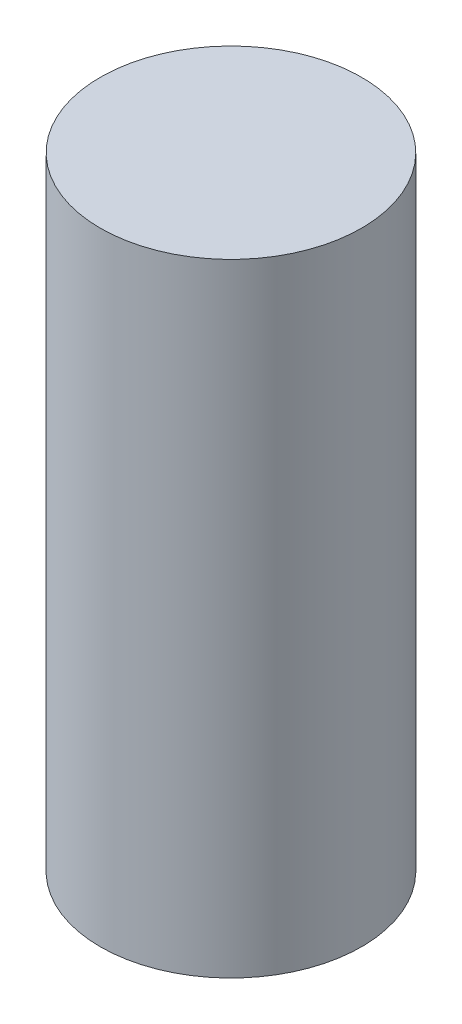
ISO-10303-21;
HEADER;
FILE_DESCRIPTION(('STEP AP214'),'2;1');
FILE_NAME('part.step','',(''),(''),'','','');
FILE_SCHEMA(('AUTOMOTIVE_DESIGN { 1 0 10303 214 1 1 1 1 }'));
ENDSEC;
DATA;
#1=APPLICATION_CONTEXT('core data for automotive mechanical design processes');
#2=APPLICATION_PROTOCOL_DEFINITION('international standard','automotive_design',2000,#1);
#3=PRODUCT_CONTEXT('',#1,'mechanical');
#4=PRODUCT('Part','Part','',(#3));
#5=PRODUCT_RELATED_PRODUCT_CATEGORY('part','',(#4));
#6=PRODUCT_DEFINITION_FORMATION('','',#4);
#7=PRODUCT_DEFINITION_CONTEXT('part definition',#1,'design');
#8=PRODUCT_DEFINITION('design','',#6,#7);
#9=PRODUCT_DEFINITION_SHAPE('','',#8);
#10=(LENGTH_UNIT() NAMED_UNIT(*) SI_UNIT(.MILLI.,.METRE.));
#11=(NAMED_UNIT(*) PLANE_ANGLE_UNIT() SI_UNIT($,.RADIAN.));
#12=(NAMED_UNIT(*) SI_UNIT($,.STERADIAN.) SOLID_ANGLE_UNIT());
#13=UNCERTAINTY_MEASURE_WITH_UNIT(LENGTH_MEASURE(1.E-05),#10,'distance_accuracy_value','');
#14=(GEOMETRIC_REPRESENTATION_CONTEXT(3) GLOBAL_UNCERTAINTY_ASSIGNED_CONTEXT((#13)) GLOBAL_UNIT_ASSIGNED_CONTEXT((#10,
#11,#12)) REPRESENTATION_CONTEXT('',''));
#15=CARTESIAN_POINT('',(0.,0.,0.));
#16=DIRECTION('',(0.,0.,1.));
#17=DIRECTION('',(1.,0.,0.));
#18=AXIS2_PLACEMENT_3D('',#15,#16,#17);
#19=CARTESIAN_POINT('',(0.,25.,0.));
#20=DIRECTION('',(0.,-1.,0.));
#21=DIRECTION('',(0.,0.,-1.));
#22=AXIS2_PLACEMENT_3D('',#19,#20,#21);
#23=CYLINDRICAL_SURFACE('',#22,5.25);
#24=CARTESIAN_POINT('',(0.,25.,0.));
#25=DIRECTION('',(0.,1.,0.));
#26=DIRECTION('',(0.,0.,1.));
#27=AXIS2_PLACEMENT_3D('',#24,#25,#26);
#28=CIRCLE('',#27,5.25);
#29=CARTESIAN_POINT('',(0.,25.,5.25));
#30=VERTEX_POINT('',#29);
#31=EDGE_CURVE('E10',#30,#30,#28,.T.);
#32=ORIENTED_EDGE('',*,*,#31,.F.);
#33=EDGE_LOOP('',(#32));
#34=FACE_BOUND('',#33,.T.);
#35=CARTESIAN_POINT('',(0.,0.,0.));
#36=DIRECTION('',(0.,1.,0.));
#37=DIRECTION('',(0.,0.,1.));
#38=AXIS2_PLACEMENT_3D('',#35,#36,#37);
#39=CIRCLE('',#38,5.25);
#40=CARTESIAN_POINT('',(0.,0.,5.25));
#41=VERTEX_POINT('',#40);
#42=EDGE_CURVE('E34',#41,#41,#39,.T.);
#43=ORIENTED_EDGE('',*,*,#42,.T.);
#44=EDGE_LOOP('',(#43));
#45=FACE_BOUND('',#44,.T.);
#46=ADVANCED_FACE('F31',(#34,#45),#23,.T.);
#47=CARTESIAN_POINT('',(0.,25.,0.));
#48=DIRECTION('',(0.,1.,0.));
#49=DIRECTION('',(0.,0.,1.));
#50=AXIS2_PLACEMENT_3D('',#47,#48,#49);
#51=PLANE('',#50);
#52=ORIENTED_EDGE('',*,*,#31,.T.);
#53=EDGE_LOOP('',(#52));
#54=FACE_BOUND('',#53,.T.);
#55=ADVANCED_FACE('F46',(#54),#51,.T.);
#56=CARTESIAN_POINT('',(0.,0.,0.));
#57=DIRECTION('',(0.,1.,0.));
#58=DIRECTION('',(0.,0.,1.));
#59=AXIS2_PLACEMENT_3D('',#56,#57,#58);
#60=PLANE('',#59);
#61=ORIENTED_EDGE('',*,*,#42,.F.);
#62=EDGE_LOOP('',(#61));
#63=FACE_BOUND('',#62,.T.);
#64=ADVANCED_FACE('F44',(#63),#60,.F.);
#65=CLOSED_SHELL('',(#46,#55,#64));
#66=MANIFOLD_SOLID_BREP('B2',#65);
#67=ADVANCED_BREP_SHAPE_REPRESENTATION('',(#18,#66),#14);
#68=SHAPE_DEFINITION_REPRESENTATION(#9,#67);
ENDSEC;
END-ISO-10303-21;
